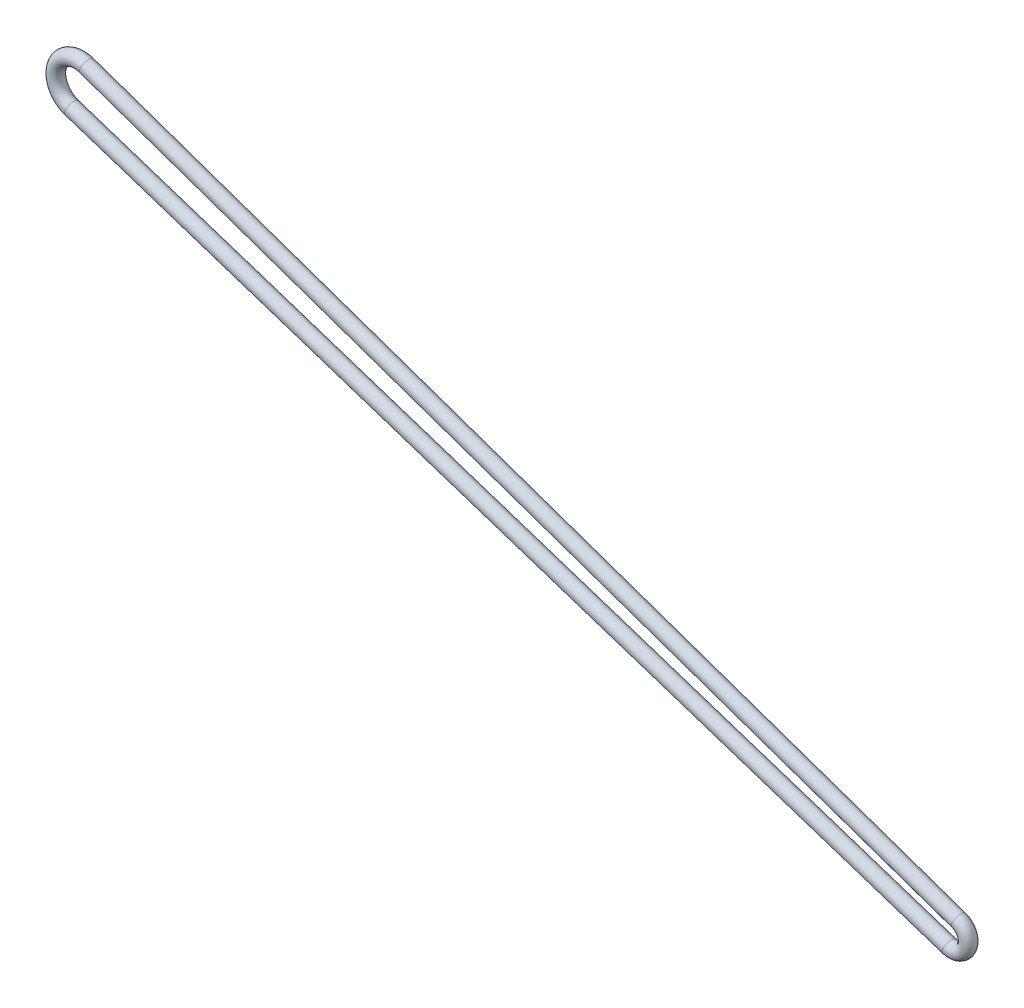
ISO-10303-21;
HEADER;
FILE_DESCRIPTION(('STEP AP214'),'2;1');
FILE_NAME('part.step','',(''),(''),'','','');
FILE_SCHEMA(('AUTOMOTIVE_DESIGN { 1 0 10303 214 1 1 1 1 }'));
ENDSEC;
DATA;
#1=APPLICATION_CONTEXT('core data for automotive mechanical design processes');
#2=APPLICATION_PROTOCOL_DEFINITION('international standard','automotive_design',2000,#1);
#3=PRODUCT_CONTEXT('',#1,'mechanical');
#4=PRODUCT('Part','Part','',(#3));
#5=PRODUCT_RELATED_PRODUCT_CATEGORY('part','',(#4));
#6=PRODUCT_DEFINITION_FORMATION('','',#4);
#7=PRODUCT_DEFINITION_CONTEXT('part definition',#1,'design');
#8=PRODUCT_DEFINITION('design','',#6,#7);
#9=PRODUCT_DEFINITION_SHAPE('','',#8);
#10=(LENGTH_UNIT() NAMED_UNIT(*) SI_UNIT(.MILLI.,.METRE.));
#11=(NAMED_UNIT(*) PLANE_ANGLE_UNIT() SI_UNIT($,.RADIAN.));
#12=(NAMED_UNIT(*) SI_UNIT($,.STERADIAN.) SOLID_ANGLE_UNIT());
#13=UNCERTAINTY_MEASURE_WITH_UNIT(LENGTH_MEASURE(1.E-05),#10,'distance_accuracy_value','');
#14=(GEOMETRIC_REPRESENTATION_CONTEXT(3) GLOBAL_UNCERTAINTY_ASSIGNED_CONTEXT((#13)) GLOBAL_UNIT_ASSIGNED_CONTEXT((#10,
#11,#12)) REPRESENTATION_CONTEXT('',''));
#15=CARTESIAN_POINT('',(0.,0.,0.));
#16=DIRECTION('',(0.,0.,1.));
#17=DIRECTION('',(1.,0.,0.));
#18=AXIS2_PLACEMENT_3D('',#15,#16,#17);
#19=CARTESIAN_POINT('',(105.837683781068,141.145459922499,0.));
#20=DIRECTION('',(0.,0.,1.));
#21=DIRECTION('',(1.,0.,0.));
#22=AXIS2_PLACEMENT_3D('',#19,#20,#21);
#23=TOROIDAL_SURFACE('',#22,4.99999999999996,1.5);
#24=CARTESIAN_POINT('',(107.483719579318,145.866748533766,0.));
#25=DIRECTION('',(-0.944257722253387,0.329207159650037,0.));
#26=DIRECTION('',(-0.329207159650037,-0.944257722253387,0.));
#27=AXIS2_PLACEMENT_3D('',#24,#25,#26);
#28=CIRCLE('',#27,1.5);
#29=CARTESIAN_POINT('',(107.977530318793,147.283135117146,0.));
#30=VERTEX_POINT('',#29);
#31=EDGE_CURVE('E13',#30,#30,#28,.T.);
#32=CARTESIAN_POINT('',(104.281932755783,136.393656186304,0.));
#33=DIRECTION('',(0.950360747239156,-0.311150205057033,0.));
#34=DIRECTION('',(0.311150205057033,0.950360747239156,0.));
#35=AXIS2_PLACEMENT_3D('',#32,#33,#34);
#36=CIRCLE('',#35,1.5);
#37=CARTESIAN_POINT('',(103.815207448197,134.968115065445,0.));
#38=VERTEX_POINT('',#37);
#39=EDGE_CURVE('E69',#38,#38,#36,.T.);
#40=CARTESIAN_POINT('',(105.837683781068,141.145459922499,0.));
#41=DIRECTION('',(0.,0.,1.));
#42=DIRECTION('',(1.,0.,0.));
#43=AXIS2_PLACEMENT_3D('',#40,#41,#42);
#44=CIRCLE('',#43,6.49999999999996);
#45=EDGE_CURVE('',#30,#38,#44,.T.);
#46=ORIENTED_EDGE('',*,*,#31,.T.);
#47=ORIENTED_EDGE('',*,*,#39,.F.);
#48=ORIENTED_EDGE('',*,*,#45,.T.);
#49=ORIENTED_EDGE('',*,*,#45,.F.);
#50=EDGE_LOOP('',(#46,#48,#47,#49));
#51=FACE_BOUND('',#50,.T.);
#52=ADVANCED_FACE('F55',(#51),#23,.T.);
#53=CARTESIAN_POINT('',(295.727834140438,80.2370916985407,0.));
#54=DIRECTION('',(-0.944257722253389,0.329207159650033,0.));
#55=DIRECTION('',(-0.329207159650033,-0.944257722253389,0.));
#56=AXIS2_PLACEMENT_3D('',#53,#54,#55);
#57=CYLINDRICAL_SURFACE('',#56,1.5);
#58=ORIENTED_EDGE('',*,*,#31,.F.);
#59=EDGE_LOOP('',(#58));
#60=FACE_BOUND('',#59,.T.);
#61=CARTESIAN_POINT('',(295.727834140438,80.2370916985407,0.));
#62=DIRECTION('',(-0.944257722253388,0.329207159650035,0.));
#63=DIRECTION('',(-0.329207159650035,-0.944257722253388,0.));
#64=AXIS2_PLACEMENT_3D('',#61,#62,#63);
#65=CIRCLE('',#64,1.5);
#66=CARTESIAN_POINT('',(296.221644879913,81.6534782819203,0.));
#67=VERTEX_POINT('',#66);
#68=EDGE_CURVE('E61',#67,#67,#65,.T.);
#69=ORIENTED_EDGE('',*,*,#68,.T.);
#70=EDGE_LOOP('',(#69));
#71=FACE_BOUND('',#70,.T.);
#72=ADVANCED_FACE('F78',(#60,#71),#57,.T.);
#73=CARTESIAN_POINT('',(294.707291945523,77.3098927595552,0.));
#74=DIRECTION('',(0.,0.,1.));
#75=DIRECTION('',(1.,0.,0.));
#76=AXIS2_PLACEMENT_3D('',#73,#74,#75);
#77=TOROIDAL_SURFACE('',#76,3.09999999999951,1.5);
#78=CARTESIAN_POINT('',(293.742726309846,74.3637744431138,0.));
#79=DIRECTION('',(0.950360747239156,-0.311150205057033,0.));
#80=DIRECTION('',(0.311150205057033,0.950360747239156,0.));
#81=AXIS2_PLACEMENT_3D('',#78,#79,#80);
#82=CIRCLE('',#81,1.5);
#83=CARTESIAN_POINT('',(293.276001002261,72.9382333222555,0.));
#84=VERTEX_POINT('',#83);
#85=EDGE_CURVE('E65',#84,#84,#82,.T.);
#86=CARTESIAN_POINT('',(294.707291945523,77.3098927595552,0.));
#87=DIRECTION('',(0.,0.,1.));
#88=DIRECTION('',(1.,0.,0.));
#89=AXIS2_PLACEMENT_3D('',#86,#87,#88);
#90=CIRCLE('',#89,4.59999999999951);
#91=EDGE_CURVE('',#84,#67,#90,.T.);
#92=ORIENTED_EDGE('',*,*,#85,.T.);
#93=ORIENTED_EDGE('',*,*,#68,.F.);
#94=ORIENTED_EDGE('',*,*,#91,.T.);
#95=ORIENTED_EDGE('',*,*,#91,.F.);
#96=EDGE_LOOP('',(#92,#94,#93,#95));
#97=FACE_BOUND('',#96,.T.);
#98=ADVANCED_FACE('F82',(#97),#77,.T.);
#99=CARTESIAN_POINT('',(104.281932755783,136.393656186304,0.));
#100=DIRECTION('',(0.950360747239157,-0.311150205057029,0.));
#101=DIRECTION('',(0.31115020505703,0.950360747239157,0.));
#102=AXIS2_PLACEMENT_3D('',#99,#100,#101);
#103=CYLINDRICAL_SURFACE('',#102,1.5);
#104=ORIENTED_EDGE('',*,*,#85,.F.);
#105=EDGE_LOOP('',(#104));
#106=FACE_BOUND('',#105,.T.);
#107=ORIENTED_EDGE('',*,*,#39,.T.);
#108=EDGE_LOOP('',(#107));
#109=FACE_BOUND('',#108,.T.);
#110=ADVANCED_FACE('F75',(#106,#109),#103,.T.);
#111=CLOSED_SHELL('',(#52,#72,#98,#110));
#112=MANIFOLD_SOLID_BREP('B2',#111);
#113=ADVANCED_BREP_SHAPE_REPRESENTATION('',(#18,#112),#14);
#114=SHAPE_DEFINITION_REPRESENTATION(#9,#113);
ENDSEC;
END-ISO-10303-21;
